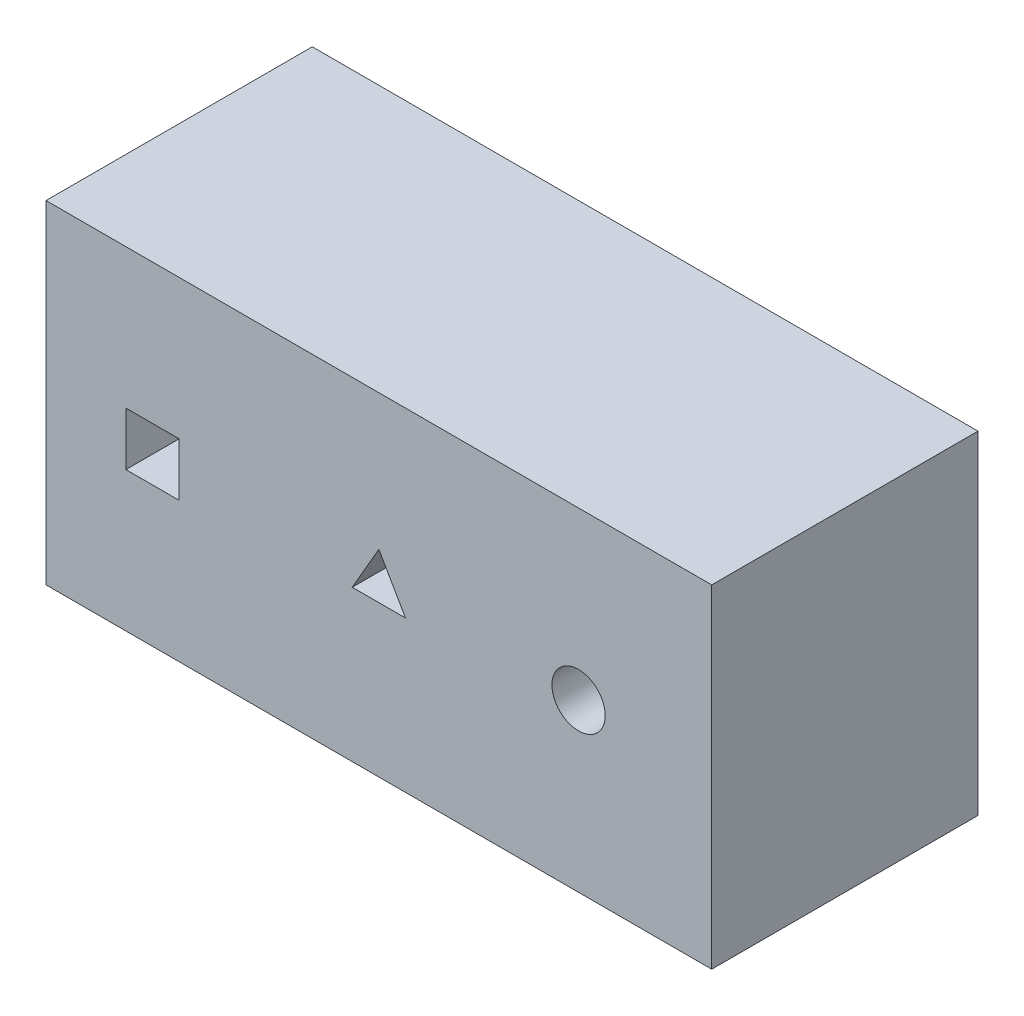
ISO-10303-21;
HEADER;
FILE_DESCRIPTION(('STEP AP214'),'2;1');
FILE_NAME('part.step','',(''),(''),'','','');
FILE_SCHEMA(('AUTOMOTIVE_DESIGN { 1 0 10303 214 1 1 1 1 }'));
ENDSEC;
DATA;
#1=APPLICATION_CONTEXT('core data for automotive mechanical design processes');
#2=APPLICATION_PROTOCOL_DEFINITION('international standard','automotive_design',2000,#1);
#3=PRODUCT_CONTEXT('',#1,'mechanical');
#4=PRODUCT('Part','Part','',(#3));
#5=PRODUCT_RELATED_PRODUCT_CATEGORY('part','',(#4));
#6=PRODUCT_DEFINITION_FORMATION('','',#4);
#7=PRODUCT_DEFINITION_CONTEXT('part definition',#1,'design');
#8=PRODUCT_DEFINITION('design','',#6,#7);
#9=PRODUCT_DEFINITION_SHAPE('','',#8);
#10=(LENGTH_UNIT() NAMED_UNIT(*) SI_UNIT(.MILLI.,.METRE.));
#11=(NAMED_UNIT(*) PLANE_ANGLE_UNIT() SI_UNIT($,.RADIAN.));
#12=(NAMED_UNIT(*) SI_UNIT($,.STERADIAN.) SOLID_ANGLE_UNIT());
#13=UNCERTAINTY_MEASURE_WITH_UNIT(LENGTH_MEASURE(1.E-05),#10,'distance_accuracy_value','');
#14=(GEOMETRIC_REPRESENTATION_CONTEXT(3) GLOBAL_UNCERTAINTY_ASSIGNED_CONTEXT((#13)) GLOBAL_UNIT_ASSIGNED_CONTEXT((#10,
#11,#12)) REPRESENTATION_CONTEXT('',''));
#15=CARTESIAN_POINT('',(0.,0.,0.));
#16=DIRECTION('',(0.,0.,1.));
#17=DIRECTION('',(1.,0.,0.));
#18=AXIS2_PLACEMENT_3D('',#15,#16,#17);
#19=CARTESIAN_POINT('',(0.,0.,100.));
#20=DIRECTION('',(0.,0.,1.));
#21=DIRECTION('',(1.,0.,0.));
#22=AXIS2_PLACEMENT_3D('',#19,#20,#21);
#23=PLANE('',#22);
#24=DIRECTION('',(0.,-1.,0.));
#25=VECTOR('',#24,1.);
#26=CARTESIAN_POINT('',(-125.,-62.5,100.));
#27=LINE('',#26,#25);
#28=CARTESIAN_POINT('',(-125.,62.5,100.));
#29=VERTEX_POINT('',#28);
#30=CARTESIAN_POINT('',(-125.,-62.5,100.));
#31=VERTEX_POINT('',#30);
#32=EDGE_CURVE('E204',#29,#31,#27,.T.);
#33=ORIENTED_EDGE('',*,*,#32,.T.);
#34=DIRECTION('',(1.,0.,0.));
#35=VECTOR('',#34,1.);
#36=CARTESIAN_POINT('',(125.,-62.5,100.));
#37=LINE('',#36,#35);
#38=CARTESIAN_POINT('',(125.,-62.5,100.));
#39=VERTEX_POINT('',#38);
#40=EDGE_CURVE('E92',#31,#39,#37,.T.);
#41=ORIENTED_EDGE('',*,*,#40,.T.);
#42=DIRECTION('',(0.,1.,0.));
#43=VECTOR('',#42,1.);
#44=CARTESIAN_POINT('',(125.,-62.5,100.));
#45=LINE('',#44,#43);
#46=CARTESIAN_POINT('',(125.,62.5,100.));
#47=VERTEX_POINT('',#46);
#48=EDGE_CURVE('E209',#39,#47,#45,.T.);
#49=ORIENTED_EDGE('',*,*,#48,.T.);
#50=DIRECTION('',(-1.,0.,0.));
#51=VECTOR('',#50,1.);
#52=CARTESIAN_POINT('',(125.,62.5,100.));
#53=LINE('',#52,#51);
#54=EDGE_CURVE('E61',#47,#29,#53,.T.);
#55=ORIENTED_EDGE('',*,*,#54,.T.);
#56=EDGE_LOOP('',(#33,#41,#49,#55));
#57=FACE_BOUND('',#56,.T.);
#58=CARTESIAN_POINT('',(74.9999999999999,0.,100.));
#59=DIRECTION('',(0.,0.,1.));
#60=DIRECTION('',(1.,0.,0.));
#61=AXIS2_PLACEMENT_3D('',#58,#59,#60);
#62=CIRCLE('',#61,9.99999999999999);
#63=CARTESIAN_POINT('',(84.9999999999999,0.,100.));
#64=VERTEX_POINT('',#63);
#65=EDGE_CURVE('E305',#64,#64,#62,.T.);
#66=ORIENTED_EDGE('',*,*,#65,.F.);
#67=EDGE_LOOP('',(#66));
#68=FACE_BOUND('',#67,.T.);
#69=DIRECTION('',(1.,0.,0.));
#70=VECTOR('',#69,1.);
#71=CARTESIAN_POINT('',(0.,10.,100.));
#72=LINE('',#71,#70);
#73=CARTESIAN_POINT('',(-95.,10.,100.));
#74=VERTEX_POINT('',#73);
#75=CARTESIAN_POINT('',(-75.,10.,100.));
#76=VERTEX_POINT('',#75);
#77=EDGE_CURVE('E293',#74,#76,#72,.T.);
#78=ORIENTED_EDGE('',*,*,#77,.T.);
#79=DIRECTION('',(0.,-1.,0.));
#80=VECTOR('',#79,1.);
#81=CARTESIAN_POINT('',(-75.,0.,100.));
#82=LINE('',#81,#80);
#83=CARTESIAN_POINT('',(-75.,-9.99999999999997,100.));
#84=VERTEX_POINT('',#83);
#85=EDGE_CURVE('E289',#76,#84,#82,.T.);
#86=ORIENTED_EDGE('',*,*,#85,.T.);
#87=DIRECTION('',(1.,0.,0.));
#88=VECTOR('',#87,1.);
#89=CARTESIAN_POINT('',(0.,-9.99999999999997,100.));
#90=LINE('',#89,#88);
#91=CARTESIAN_POINT('',(-95.,-9.99999999999997,100.));
#92=VERTEX_POINT('',#91);
#93=EDGE_CURVE('E177',#92,#84,#90,.T.);
#94=ORIENTED_EDGE('',*,*,#93,.F.);
#95=DIRECTION('',(0.,-1.,0.));
#96=VECTOR('',#95,1.);
#97=CARTESIAN_POINT('',(-95.,0.,100.));
#98=LINE('',#97,#96);
#99=EDGE_CURVE('E182',#74,#92,#98,.T.);
#100=ORIENTED_EDGE('',*,*,#99,.F.);
#101=EDGE_LOOP('',(#78,#86,#94,#100));
#102=FACE_BOUND('',#101,.T.);
#103=DIRECTION('',(0.5,-0.866025403784439,0.));
#104=VECTOR('',#103,1.);
#105=CARTESIAN_POINT('',(5.,2.88675134594813,100.));
#106=LINE('',#105,#104);
#107=CARTESIAN_POINT('',(0.,11.5470053837925,100.));
#108=VERTEX_POINT('',#107);
#109=CARTESIAN_POINT('',(9.99999999999999,-5.77350269189625,100.));
#110=VERTEX_POINT('',#109);
#111=EDGE_CURVE('E160',#108,#110,#106,.T.);
#112=ORIENTED_EDGE('',*,*,#111,.T.);
#113=DIRECTION('',(-1.,0.,0.));
#114=VECTOR('',#113,1.);
#115=CARTESIAN_POINT('',(0.,-5.77350269189625,100.));
#116=LINE('',#115,#114);
#117=CARTESIAN_POINT('',(-10.,-5.77350269189626,100.));
#118=VERTEX_POINT('',#117);
#119=EDGE_CURVE('E284',#110,#118,#116,.T.);
#120=ORIENTED_EDGE('',*,*,#119,.T.);
#121=DIRECTION('',(0.5,0.866025403784439,0.));
#122=VECTOR('',#121,1.);
#123=CARTESIAN_POINT('',(-5.00000000000001,2.88675134594813,100.));
#124=LINE('',#123,#122);
#125=EDGE_CURVE('E148',#118,#108,#124,.T.);
#126=ORIENTED_EDGE('',*,*,#125,.T.);
#127=EDGE_LOOP('',(#112,#120,#126));
#128=FACE_BOUND('',#127,.T.);
#129=ADVANCED_FACE('F43',(#57,#68,#102,#128),#23,.T.);
#130=CARTESIAN_POINT('',(0.,0.,0.));
#131=DIRECTION('',(0.,0.,1.));
#132=DIRECTION('',(1.,0.,0.));
#133=AXIS2_PLACEMENT_3D('',#130,#131,#132);
#134=PLANE('',#133);
#135=DIRECTION('',(0.,-1.,0.));
#136=VECTOR('',#135,1.);
#137=CARTESIAN_POINT('',(-125.,-62.5,0.));
#138=LINE('',#137,#136);
#139=CARTESIAN_POINT('',(-125.,62.5,0.));
#140=VERTEX_POINT('',#139);
#141=CARTESIAN_POINT('',(-125.,-62.5,0.));
#142=VERTEX_POINT('',#141);
#143=EDGE_CURVE('E203',#140,#142,#138,.T.);
#144=ORIENTED_EDGE('',*,*,#143,.F.);
#145=DIRECTION('',(-1.,0.,0.));
#146=VECTOR('',#145,1.);
#147=CARTESIAN_POINT('',(125.,62.5,0.));
#148=LINE('',#147,#146);
#149=CARTESIAN_POINT('',(125.,62.5,0.));
#150=VERTEX_POINT('',#149);
#151=EDGE_CURVE('E85',#150,#140,#148,.T.);
#152=ORIENTED_EDGE('',*,*,#151,.F.);
#153=DIRECTION('',(0.,1.,0.));
#154=VECTOR('',#153,1.);
#155=CARTESIAN_POINT('',(125.,-62.5,0.));
#156=LINE('',#155,#154);
#157=CARTESIAN_POINT('',(125.,-62.5,0.));
#158=VERTEX_POINT('',#157);
#159=EDGE_CURVE('E79',#158,#150,#156,.T.);
#160=ORIENTED_EDGE('',*,*,#159,.F.);
#161=DIRECTION('',(1.,0.,0.));
#162=VECTOR('',#161,1.);
#163=CARTESIAN_POINT('',(125.,-62.5,0.));
#164=LINE('',#163,#162);
#165=EDGE_CURVE('E218',#142,#158,#164,.T.);
#166=ORIENTED_EDGE('',*,*,#165,.F.);
#167=EDGE_LOOP('',(#144,#152,#160,#166));
#168=FACE_BOUND('',#167,.T.);
#169=DIRECTION('',(-0.5,0.866025403784439,0.));
#170=VECTOR('',#169,1.);
#171=CARTESIAN_POINT('',(5.,2.88675134594813,0.));
#172=LINE('',#171,#170);
#173=CARTESIAN_POINT('',(9.99999999999999,-5.77350269189625,0.));
#174=VERTEX_POINT('',#173);
#175=CARTESIAN_POINT('',(0.,11.5470053837925,0.));
#176=VERTEX_POINT('',#175);
#177=EDGE_CURVE('E136',#174,#176,#172,.T.);
#178=ORIENTED_EDGE('',*,*,#177,.T.);
#179=DIRECTION('',(-0.5,-0.866025403784439,0.));
#180=VECTOR('',#179,1.);
#181=CARTESIAN_POINT('',(-5.00000000000001,2.88675134594813,0.));
#182=LINE('',#181,#180);
#183=CARTESIAN_POINT('',(-10.,-5.77350269189626,-1.11022302462516E-13));
#184=VERTEX_POINT('',#183);
#185=EDGE_CURVE('E140',#176,#184,#182,.T.);
#186=ORIENTED_EDGE('',*,*,#185,.T.);
#187=DIRECTION('',(1.,0.,0.));
#188=VECTOR('',#187,1.);
#189=CARTESIAN_POINT('',(0.,-5.77350269189625,0.));
#190=LINE('',#189,#188);
#191=EDGE_CURVE('E143',#184,#174,#190,.T.);
#192=ORIENTED_EDGE('',*,*,#191,.T.);
#193=EDGE_LOOP('',(#178,#186,#192));
#194=FACE_BOUND('',#193,.T.);
#195=DIRECTION('',(-1.,0.,0.));
#196=VECTOR('',#195,1.);
#197=CARTESIAN_POINT('',(0.,10.,0.));
#198=LINE('',#197,#196);
#199=CARTESIAN_POINT('',(-75.,10.,0.));
#200=VERTEX_POINT('',#199);
#201=CARTESIAN_POINT('',(-95.,10.,0.));
#202=VERTEX_POINT('',#201);
#203=EDGE_CURVE('E191',#200,#202,#198,.T.);
#204=ORIENTED_EDGE('',*,*,#203,.T.);
#205=DIRECTION('',(0.,1.,0.));
#206=VECTOR('',#205,1.);
#207=CARTESIAN_POINT('',(-95.,0.,0.));
#208=LINE('',#207,#206);
#209=CARTESIAN_POINT('',(-95.,-9.99999999999997,0.));
#210=VERTEX_POINT('',#209);
#211=EDGE_CURVE('E168',#210,#202,#208,.T.);
#212=ORIENTED_EDGE('',*,*,#211,.F.);
#213=DIRECTION('',(-1.,0.,0.));
#214=VECTOR('',#213,1.);
#215=CARTESIAN_POINT('',(0.,-9.99999999999997,0.));
#216=LINE('',#215,#214);
#217=CARTESIAN_POINT('',(-75.,-9.99999999999997,-1.11022302462516E-13));
#218=VERTEX_POINT('',#217);
#219=EDGE_CURVE('E186',#218,#210,#216,.T.);
#220=ORIENTED_EDGE('',*,*,#219,.F.);
#221=DIRECTION('',(0.,1.,0.));
#222=VECTOR('',#221,1.);
#223=CARTESIAN_POINT('',(-75.,0.,0.));
#224=LINE('',#223,#222);
#225=EDGE_CURVE('E194',#218,#200,#224,.T.);
#226=ORIENTED_EDGE('',*,*,#225,.T.);
#227=EDGE_LOOP('',(#204,#212,#220,#226));
#228=FACE_BOUND('',#227,.T.);
#229=CARTESIAN_POINT('',(74.9999999999999,0.,0.));
#230=DIRECTION('',(0.,0.,1.));
#231=DIRECTION('',(1.,0.,0.));
#232=AXIS2_PLACEMENT_3D('',#229,#230,#231);
#233=CIRCLE('',#232,9.99999999999999);
#234=CARTESIAN_POINT('',(84.9999999999999,0.,0.));
#235=VERTEX_POINT('',#234);
#236=EDGE_CURVE('E173',#235,#235,#233,.F.);
#237=ORIENTED_EDGE('',*,*,#236,.F.);
#238=EDGE_LOOP('',(#237));
#239=FACE_BOUND('',#238,.T.);
#240=ADVANCED_FACE('F138',(#168,#194,#228,#239),#134,.F.);
#241=CARTESIAN_POINT('',(-125.,-62.5,100.));
#242=DIRECTION('',(1.,0.,0.));
#243=DIRECTION('',(0.,0.,-1.));
#244=AXIS2_PLACEMENT_3D('',#241,#242,#243);
#245=PLANE('',#244);
#246=ORIENTED_EDGE('',*,*,#143,.T.);
#247=DIRECTION('',(0.,0.,-1.));
#248=VECTOR('',#247,1.);
#249=CARTESIAN_POINT('',(-125.,-62.5,100.));
#250=LINE('',#249,#248);
#251=EDGE_CURVE('E11',#31,#142,#250,.T.);
#252=ORIENTED_EDGE('',*,*,#251,.F.);
#253=ORIENTED_EDGE('',*,*,#32,.F.);
#254=DIRECTION('',(0.,0.,-1.));
#255=VECTOR('',#254,1.);
#256=CARTESIAN_POINT('',(-125.,62.5,100.));
#257=LINE('',#256,#255);
#258=EDGE_CURVE('E214',#29,#140,#257,.T.);
#259=ORIENTED_EDGE('',*,*,#258,.T.);
#260=EDGE_LOOP('',(#246,#252,#253,#259));
#261=FACE_BOUND('',#260,.T.);
#262=ADVANCED_FACE('F45',(#261),#245,.F.);
#263=CARTESIAN_POINT('',(125.,-62.5,100.));
#264=DIRECTION('',(0.,1.,0.));
#265=DIRECTION('',(-1.,0.,0.));
#266=AXIS2_PLACEMENT_3D('',#263,#264,#265);
#267=PLANE('',#266);
#268=ORIENTED_EDGE('',*,*,#165,.T.);
#269=DIRECTION('',(0.,0.,-1.));
#270=VECTOR('',#269,1.);
#271=CARTESIAN_POINT('',(125.,-62.5,100.));
#272=LINE('',#271,#270);
#273=EDGE_CURVE('E53',#39,#158,#272,.T.);
#274=ORIENTED_EDGE('',*,*,#273,.F.);
#275=ORIENTED_EDGE('',*,*,#40,.F.);
#276=ORIENTED_EDGE('',*,*,#251,.T.);
#277=EDGE_LOOP('',(#268,#274,#275,#276));
#278=FACE_BOUND('',#277,.T.);
#279=ADVANCED_FACE('F245',(#278),#267,.F.);
#280=CARTESIAN_POINT('',(125.,-62.5,100.));
#281=DIRECTION('',(-1.,0.,0.));
#282=DIRECTION('',(0.,0.,1.));
#283=AXIS2_PLACEMENT_3D('',#280,#281,#282);
#284=PLANE('',#283);
#285=ORIENTED_EDGE('',*,*,#159,.T.);
#286=DIRECTION('',(0.,0.,-1.));
#287=VECTOR('',#286,1.);
#288=CARTESIAN_POINT('',(125.,62.5,100.));
#289=LINE('',#288,#287);
#290=EDGE_CURVE('E227',#47,#150,#289,.T.);
#291=ORIENTED_EDGE('',*,*,#290,.F.);
#292=ORIENTED_EDGE('',*,*,#48,.F.);
#293=ORIENTED_EDGE('',*,*,#273,.T.);
#294=EDGE_LOOP('',(#285,#291,#292,#293));
#295=FACE_BOUND('',#294,.T.);
#296=ADVANCED_FACE('F231',(#295),#284,.F.);
#297=CARTESIAN_POINT('',(125.,62.5,100.));
#298=DIRECTION('',(0.,-1.,0.));
#299=DIRECTION('',(1.,0.,0.));
#300=AXIS2_PLACEMENT_3D('',#297,#298,#299);
#301=PLANE('',#300);
#302=ORIENTED_EDGE('',*,*,#151,.T.);
#303=ORIENTED_EDGE('',*,*,#258,.F.);
#304=ORIENTED_EDGE('',*,*,#54,.F.);
#305=ORIENTED_EDGE('',*,*,#290,.T.);
#306=EDGE_LOOP('',(#302,#303,#304,#305));
#307=FACE_BOUND('',#306,.T.);
#308=ADVANCED_FACE('F237',(#307),#301,.F.);
#309=CARTESIAN_POINT('',(5.,2.88675134594813,-279.508497187474));
#310=DIRECTION('',(-0.866025403784439,-0.5,0.));
#311=DIRECTION('',(0.5,-0.866025403784439,0.));
#312=AXIS2_PLACEMENT_3D('',#309,#310,#311);
#313=PLANE('',#312);
#314=ORIENTED_EDGE('',*,*,#177,.F.);
#315=DIRECTION('',(0.,0.,1.));
#316=VECTOR('',#315,1.);
#317=CARTESIAN_POINT('',(9.99999999999999,-5.77350269189625,-279.508497187474));
#318=LINE('',#317,#316);
#319=EDGE_CURVE('E164',#174,#110,#318,.T.);
#320=ORIENTED_EDGE('',*,*,#319,.T.);
#321=ORIENTED_EDGE('',*,*,#111,.F.);
#322=DIRECTION('',(0.,0.,1.));
#323=VECTOR('',#322,1.);
#324=CARTESIAN_POINT('',(0.,11.5470053837925,-279.508497187474));
#325=LINE('',#324,#323);
#326=EDGE_CURVE('E153',#176,#108,#325,.T.);
#327=ORIENTED_EDGE('',*,*,#326,.F.);
#328=EDGE_LOOP('',(#314,#320,#321,#327));
#329=FACE_BOUND('',#328,.T.);
#330=ADVANCED_FACE('F158',(#329),#313,.T.);
#331=CARTESIAN_POINT('',(-5.00000000000001,2.88675134594813,-279.508497187474));
#332=DIRECTION('',(0.866025403784439,-0.5,0.));
#333=DIRECTION('',(0.5,0.866025403784439,0.));
#334=AXIS2_PLACEMENT_3D('',#331,#332,#333);
#335=PLANE('',#334);
#336=ORIENTED_EDGE('',*,*,#185,.F.);
#337=ORIENTED_EDGE('',*,*,#326,.T.);
#338=ORIENTED_EDGE('',*,*,#125,.F.);
#339=DIRECTION('',(0.,0.,1.));
#340=VECTOR('',#339,1.);
#341=CARTESIAN_POINT('',(-10.,-5.77350269189626,-279.508497187474));
#342=LINE('',#341,#340);
#343=EDGE_CURVE('E155',#184,#118,#342,.T.);
#344=ORIENTED_EDGE('',*,*,#343,.F.);
#345=EDGE_LOOP('',(#336,#337,#338,#344));
#346=FACE_BOUND('',#345,.T.);
#347=ADVANCED_FACE('F151',(#346),#335,.T.);
#348=CARTESIAN_POINT('',(0.,10.,-279.508497187474));
#349=DIRECTION('',(0.,-1.,0.));
#350=DIRECTION('',(0.,0.,-1.));
#351=AXIS2_PLACEMENT_3D('',#348,#349,#350);
#352=PLANE('',#351);
#353=ORIENTED_EDGE('',*,*,#203,.F.);
#354=DIRECTION('',(0.,0.,1.));
#355=VECTOR('',#354,1.);
#356=CARTESIAN_POINT('',(-75.,10.,-279.508497187474));
#357=LINE('',#356,#355);
#358=EDGE_CURVE('E163',#200,#76,#357,.T.);
#359=ORIENTED_EDGE('',*,*,#358,.T.);
#360=ORIENTED_EDGE('',*,*,#77,.F.);
#361=DIRECTION('',(0.,0.,1.));
#362=VECTOR('',#361,1.);
#363=CARTESIAN_POINT('',(-95.,10.,-279.508497187474));
#364=LINE('',#363,#362);
#365=EDGE_CURVE('E179',#202,#74,#364,.T.);
#366=ORIENTED_EDGE('',*,*,#365,.F.);
#367=EDGE_LOOP('',(#353,#359,#360,#366));
#368=FACE_BOUND('',#367,.T.);
#369=ADVANCED_FACE('F260',(#368),#352,.T.);
#370=CARTESIAN_POINT('',(-95.,0.,-279.508497187474));
#371=DIRECTION('',(-1.,0.,0.));
#372=DIRECTION('',(0.,0.,1.));
#373=AXIS2_PLACEMENT_3D('',#370,#371,#372);
#374=PLANE('',#373);
#375=DIRECTION('',(0.,0.,1.));
#376=VECTOR('',#375,1.);
#377=CARTESIAN_POINT('',(-95.,-9.99999999999997,-279.508497187474));
#378=LINE('',#377,#376);
#379=EDGE_CURVE('E183',#210,#92,#378,.T.);
#380=ORIENTED_EDGE('',*,*,#379,.F.);
#381=ORIENTED_EDGE('',*,*,#211,.T.);
#382=ORIENTED_EDGE('',*,*,#365,.T.);
#383=ORIENTED_EDGE('',*,*,#99,.T.);
#384=EDGE_LOOP('',(#380,#381,#382,#383));
#385=FACE_BOUND('',#384,.T.);
#386=ADVANCED_FACE('F263',(#385),#374,.F.);
#387=CARTESIAN_POINT('',(0.,-9.99999999999997,-279.508497187474));
#388=DIRECTION('',(0.,-1.,0.));
#389=DIRECTION('',(0.,0.,-1.));
#390=AXIS2_PLACEMENT_3D('',#387,#388,#389);
#391=PLANE('',#390);
#392=DIRECTION('',(0.,0.,1.));
#393=VECTOR('',#392,1.);
#394=CARTESIAN_POINT('',(-75.,-9.99999999999997,-279.508497187474));
#395=LINE('',#394,#393);
#396=EDGE_CURVE('E176',#218,#84,#395,.T.);
#397=ORIENTED_EDGE('',*,*,#396,.F.);
#398=ORIENTED_EDGE('',*,*,#219,.T.);
#399=ORIENTED_EDGE('',*,*,#379,.T.);
#400=ORIENTED_EDGE('',*,*,#93,.T.);
#401=EDGE_LOOP('',(#397,#398,#399,#400));
#402=FACE_BOUND('',#401,.T.);
#403=ADVANCED_FACE('F267',(#402),#391,.F.);
#404=CARTESIAN_POINT('',(0.,-5.77350269189625,-279.508497187474));
#405=DIRECTION('',(0.,1.,0.));
#406=DIRECTION('',(-1.,0.,0.));
#407=AXIS2_PLACEMENT_3D('',#404,#405,#406);
#408=PLANE('',#407);
#409=ORIENTED_EDGE('',*,*,#191,.F.);
#410=ORIENTED_EDGE('',*,*,#343,.T.);
#411=ORIENTED_EDGE('',*,*,#119,.F.);
#412=ORIENTED_EDGE('',*,*,#319,.F.);
#413=EDGE_LOOP('',(#409,#410,#411,#412));
#414=FACE_BOUND('',#413,.T.);
#415=ADVANCED_FACE('F271',(#414),#408,.T.);
#416=CARTESIAN_POINT('',(-75.,0.,-279.508497187474));
#417=DIRECTION('',(-1.,0.,0.));
#418=DIRECTION('',(0.,0.,1.));
#419=AXIS2_PLACEMENT_3D('',#416,#417,#418);
#420=PLANE('',#419);
#421=ORIENTED_EDGE('',*,*,#225,.F.);
#422=ORIENTED_EDGE('',*,*,#396,.T.);
#423=ORIENTED_EDGE('',*,*,#85,.F.);
#424=ORIENTED_EDGE('',*,*,#358,.F.);
#425=EDGE_LOOP('',(#421,#422,#423,#424));
#426=FACE_BOUND('',#425,.T.);
#427=ADVANCED_FACE('F258',(#426),#420,.T.);
#428=CARTESIAN_POINT('',(74.9999999999999,0.,-279.508497187474));
#429=DIRECTION('',(0.,0.,1.));
#430=DIRECTION('',(1.,0.,0.));
#431=AXIS2_PLACEMENT_3D('',#428,#429,#430);
#432=CYLINDRICAL_SURFACE('',#431,9.99999999999999);
#433=CARTESIAN_POINT('',(84.9999999999999,0.,0.));
#434=CARTESIAN_POINT('',(84.9999999999999,0.,1.04166666666661));
#435=CARTESIAN_POINT('',(84.9999999999999,0.,2.08333333333327));
#436=CARTESIAN_POINT('',(84.9999999999999,0.,4.1666666666666));
#437=CARTESIAN_POINT('',(84.9999999999999,0.,5.20833333333326));
#438=CARTESIAN_POINT('',(84.9999999999999,0.,7.2916666666666));
#439=CARTESIAN_POINT('',(84.9999999999999,0.,8.33333333333329));
#440=CARTESIAN_POINT('',(84.9999999999999,0.,10.4166666666666));
#441=CARTESIAN_POINT('',(84.9999999999999,0.,11.4583333333333));
#442=CARTESIAN_POINT('',(84.9999999999999,0.,13.5416666666666));
#443=CARTESIAN_POINT('',(84.9999999999999,0.,14.5833333333333));
#444=CARTESIAN_POINT('',(84.9999999999999,0.,16.6666666666666));
#445=CARTESIAN_POINT('',(84.9999999999999,0.,17.7083333333333));
#446=CARTESIAN_POINT('',(84.9999999999999,0.,19.7916666666667));
#447=CARTESIAN_POINT('',(84.9999999999999,0.,20.8333333333333));
#448=CARTESIAN_POINT('',(84.9999999999999,0.,22.9166666666666));
#449=CARTESIAN_POINT('',(84.9999999999999,0.,23.9583333333333));
#450=CARTESIAN_POINT('',(84.9999999999999,0.,26.0416666666666));
#451=CARTESIAN_POINT('',(84.9999999999999,0.,27.0833333333333));
#452=CARTESIAN_POINT('',(84.9999999999999,0.,29.1666666666666));
#453=CARTESIAN_POINT('',(84.9999999999999,0.,30.2083333333333));
#454=CARTESIAN_POINT('',(84.9999999999999,0.,32.2916666666666));
#455=CARTESIAN_POINT('',(84.9999999999999,0.,33.3333333333333));
#456=CARTESIAN_POINT('',(84.9999999999999,0.,35.4166666666667));
#457=CARTESIAN_POINT('',(84.9999999999999,0.,36.4583333333333));
#458=CARTESIAN_POINT('',(84.9999999999999,0.,38.5416666666666));
#459=CARTESIAN_POINT('',(84.9999999999999,0.,39.5833333333333));
#460=CARTESIAN_POINT('',(84.9999999999999,0.,41.6666666666667));
#461=CARTESIAN_POINT('',(84.9999999999999,0.,42.7083333333333));
#462=CARTESIAN_POINT('',(84.9999999999999,0.,44.7916666666667));
#463=CARTESIAN_POINT('',(84.9999999999999,0.,45.8333333333333));
#464=CARTESIAN_POINT('',(84.9999999999999,0.,47.9166666666667));
#465=CARTESIAN_POINT('',(84.9999999999999,0.,48.9583333333333));
#466=CARTESIAN_POINT('',(84.9999999999999,0.,51.0416666666667));
#467=CARTESIAN_POINT('',(84.9999999999999,0.,52.0833333333333));
#468=CARTESIAN_POINT('',(84.9999999999999,0.,54.1666666666666));
#469=CARTESIAN_POINT('',(84.9999999999999,0.,55.2083333333333));
#470=CARTESIAN_POINT('',(84.9999999999999,0.,57.2916666666667));
#471=CARTESIAN_POINT('',(84.9999999999999,0.,58.3333333333333));
#472=CARTESIAN_POINT('',(84.9999999999999,0.,60.4166666666667));
#473=CARTESIAN_POINT('',(84.9999999999999,0.,61.4583333333333));
#474=CARTESIAN_POINT('',(84.9999999999999,0.,63.5416666666667));
#475=CARTESIAN_POINT('',(84.9999999999999,0.,64.5833333333333));
#476=CARTESIAN_POINT('',(84.9999999999999,0.,66.6666666666667));
#477=CARTESIAN_POINT('',(84.9999999999999,0.,67.7083333333334));
#478=CARTESIAN_POINT('',(84.9999999999999,0.,69.7916666666667));
#479=CARTESIAN_POINT('',(84.9999999999999,0.,70.8333333333334));
#480=CARTESIAN_POINT('',(84.9999999999999,0.,72.9166666666667));
#481=CARTESIAN_POINT('',(84.9999999999999,0.,73.9583333333333));
#482=CARTESIAN_POINT('',(84.9999999999999,0.,76.0416666666667));
#483=CARTESIAN_POINT('',(84.9999999999999,0.,77.0833333333333));
#484=CARTESIAN_POINT('',(84.9999999999999,0.,79.1666666666667));
#485=CARTESIAN_POINT('',(84.9999999999999,0.,80.2083333333333));
#486=CARTESIAN_POINT('',(84.9999999999999,0.,82.2916666666667));
#487=CARTESIAN_POINT('',(84.9999999999999,0.,83.3333333333334));
#488=CARTESIAN_POINT('',(84.9999999999999,0.,85.4166666666667));
#489=CARTESIAN_POINT('',(84.9999999999999,0.,86.4583333333334));
#490=CARTESIAN_POINT('',(84.9999999999999,0.,88.5416666666667));
#491=CARTESIAN_POINT('',(84.9999999999999,0.,89.5833333333333));
#492=CARTESIAN_POINT('',(84.9999999999999,0.,91.6666666666667));
#493=CARTESIAN_POINT('',(84.9999999999999,0.,92.7083333333334));
#494=CARTESIAN_POINT('',(84.9999999999999,0.,94.7916666666667));
#495=CARTESIAN_POINT('',(84.9999999999999,0.,95.8333333333334));
#496=CARTESIAN_POINT('',(84.9999999999999,0.,97.9166666666667));
#497=CARTESIAN_POINT('',(84.9999999999999,0.,98.9583333333334));
#498=CARTESIAN_POINT('',(84.9999999999999,0.,100.));
#499=B_SPLINE_CURVE_WITH_KNOTS('',3,(#433,#434,#435,#436,#437,#438,#439,#440,#441,#442,#443,
#444,#445,#446,#447,#448,#449,#450,#451,#452,#453,#454,#455,#456,#457,#458,#459,#460,#461,#462,
#463,#464,#465,#466,#467,#468,#469,#470,#471,#472,#473,#474,#475,#476,#477,#478,#479,#480,#481,
#482,#483,#484,#485,#486,#487,#488,#489,#490,#491,#492,#493,#494,#495,#496,#497,#498),
.UNSPECIFIED.,.F.,.F.,(4,2,2,2,2,2,2,2,2,2,2,2,2,2,2,2,2,2,2,2,2,2,2,2,2,2,2,2,2,2,2,2,4),(0.,
3.12499999999999,6.24999999999998,9.37500000000002,12.5,15.625,18.75,21.875,25.,28.125,31.25,
34.375,37.5,40.625,43.7500000000001,46.8750000000001,50.,53.125,56.25,59.3750000000001,
62.5000000000001,65.625,68.7500000000001,71.8750000000001,75.0000000000001,78.1250000000001,
81.25,84.3750000000001,87.5000000000001,90.6250000000001,93.7500000000001,96.8750000000001,
100.),.UNSPECIFIED.);
#500=EDGE_CURVE('BSEAM255',#235,#64,#499,.T.);
#501=ORIENTED_EDGE('',*,*,#236,.T.);
#502=ORIENTED_EDGE('',*,*,#65,.T.);
#503=ORIENTED_EDGE('',*,*,#500,.T.);
#504=ORIENTED_EDGE('',*,*,#500,.F.);
#505=EDGE_LOOP('',(#501,#503,#502,#504));
#506=FACE_BOUND('',#505,.T.);
#507=ADVANCED_FACE('F255',(#506),#432,.F.);
#508=CLOSED_SHELL('',(#129,#240,#262,#279,#296,#308,#330,#347,#369,#386,#403,#415,#427,#507));
#509=MANIFOLD_SOLID_BREP('B2',#508);
#510=ADVANCED_BREP_SHAPE_REPRESENTATION('',(#18,#509),#14);
#511=SHAPE_DEFINITION_REPRESENTATION(#9,#510);
ENDSEC;
END-ISO-10303-21;
